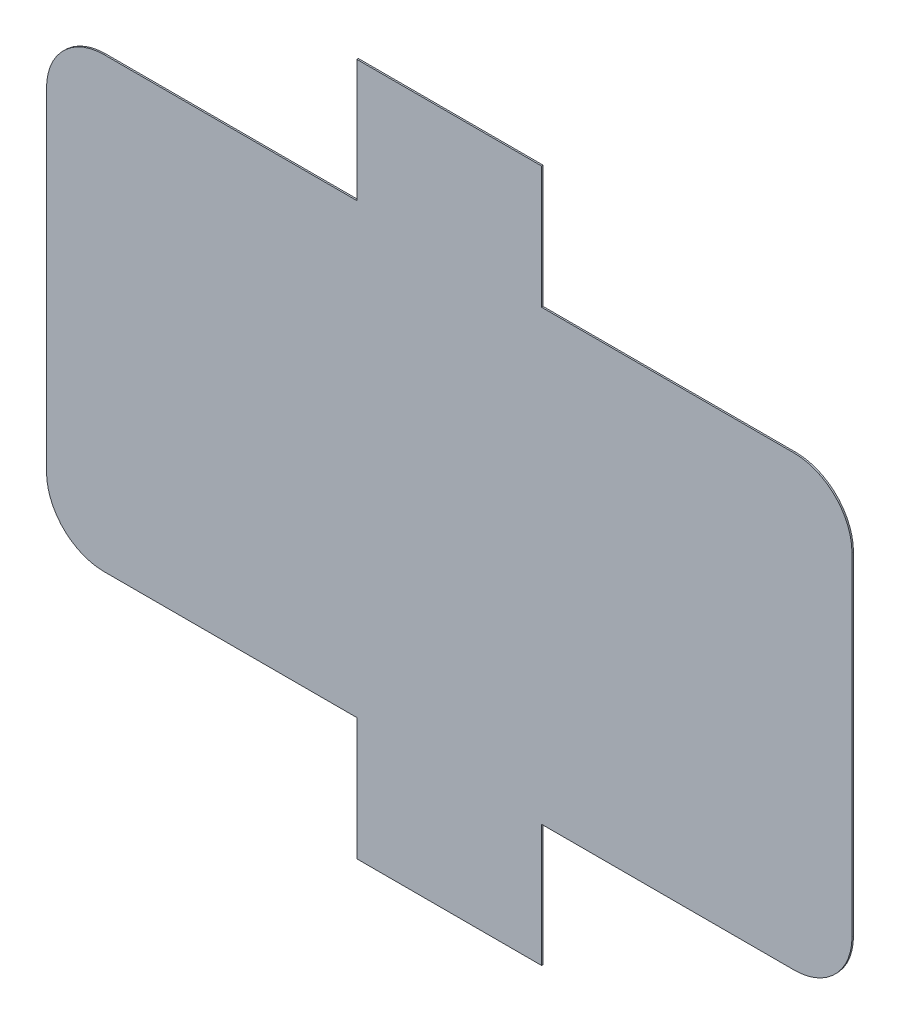
ISO-10303-21;
HEADER;
FILE_DESCRIPTION(('STEP AP214'),'2;1');
FILE_NAME('part.step','',(''),(''),'','','');
FILE_SCHEMA(('AUTOMOTIVE_DESIGN { 1 0 10303 214 1 1 1 1 }'));
ENDSEC;
DATA;
#1=APPLICATION_CONTEXT('core data for automotive mechanical design processes');
#2=APPLICATION_PROTOCOL_DEFINITION('international standard','automotive_design',2000,#1);
#3=PRODUCT_CONTEXT('',#1,'mechanical');
#4=PRODUCT('Part','Part','',(#3));
#5=PRODUCT_RELATED_PRODUCT_CATEGORY('part','',(#4));
#6=PRODUCT_DEFINITION_FORMATION('','',#4);
#7=PRODUCT_DEFINITION_CONTEXT('part definition',#1,'design');
#8=PRODUCT_DEFINITION('design','',#6,#7);
#9=PRODUCT_DEFINITION_SHAPE('','',#8);
#10=(LENGTH_UNIT() NAMED_UNIT(*) SI_UNIT(.MILLI.,.METRE.));
#11=(NAMED_UNIT(*) PLANE_ANGLE_UNIT() SI_UNIT($,.RADIAN.));
#12=(NAMED_UNIT(*) SI_UNIT($,.STERADIAN.) SOLID_ANGLE_UNIT());
#13=UNCERTAINTY_MEASURE_WITH_UNIT(LENGTH_MEASURE(1.E-05),#10,'distance_accuracy_value','');
#14=(GEOMETRIC_REPRESENTATION_CONTEXT(3) GLOBAL_UNCERTAINTY_ASSIGNED_CONTEXT((#13)) GLOBAL_UNIT_ASSIGNED_CONTEXT((#10,
#11,#12)) REPRESENTATION_CONTEXT('',''));
#15=CARTESIAN_POINT('',(0.,0.,0.));
#16=DIRECTION('',(0.,0.,1.));
#17=DIRECTION('',(1.,0.,0.));
#18=AXIS2_PLACEMENT_3D('',#15,#16,#17);
#19=CARTESIAN_POINT('',(-38.,30.,0.13));
#20=DIRECTION('',(0.,-1.,0.));
#21=DIRECTION('',(0.,0.,-1.));
#22=AXIS2_PLACEMENT_3D('',#19,#20,#21);
#23=PLANE('',#22);
#24=DIRECTION('',(-1.,0.,0.));
#25=VECTOR('',#24,1.);
#26=CARTESIAN_POINT('',(-38.,30.,0.13));
#27=LINE('',#26,#25);
#28=CARTESIAN_POINT('',(8.,30.,0.13));
#29=VERTEX_POINT('',#28);
#30=CARTESIAN_POINT('',(-8.,30.,0.13));
#31=VERTEX_POINT('',#30);
#32=EDGE_CURVE('E46',#29,#31,#27,.T.);
#33=ORIENTED_EDGE('',*,*,#32,.F.);
#34=DIRECTION('',(0.,0.,1.));
#35=VECTOR('',#34,1.);
#36=CARTESIAN_POINT('',(8.,30.,0.));
#37=LINE('',#36,#35);
#38=CARTESIAN_POINT('',(8.,30.,0.));
#39=VERTEX_POINT('',#38);
#40=EDGE_CURVE('E252',#39,#29,#37,.T.);
#41=ORIENTED_EDGE('',*,*,#40,.F.);
#42=DIRECTION('',(-1.,0.,0.));
#43=VECTOR('',#42,1.);
#44=CARTESIAN_POINT('',(-38.,30.,0.));
#45=LINE('',#44,#43);
#46=CARTESIAN_POINT('',(-8.,30.,0.));
#47=VERTEX_POINT('',#46);
#48=EDGE_CURVE('E272',#39,#47,#45,.T.);
#49=ORIENTED_EDGE('',*,*,#48,.T.);
#50=DIRECTION('',(0.,0.,1.));
#51=VECTOR('',#50,1.);
#52=CARTESIAN_POINT('',(-8.,30.,0.));
#53=LINE('',#52,#51);
#54=EDGE_CURVE('E53',#47,#31,#53,.T.);
#55=ORIENTED_EDGE('',*,*,#54,.T.);
#56=EDGE_LOOP('',(#33,#41,#49,#55));
#57=FACE_BOUND('',#56,.T.);
#58=ADVANCED_FACE('F37',(#57),#23,.F.);
#59=CARTESIAN_POINT('',(-38.,-30.,0.13));
#60=DIRECTION('',(0.,1.,0.));
#61=DIRECTION('',(0.,0.,1.));
#62=AXIS2_PLACEMENT_3D('',#59,#60,#61);
#63=PLANE('',#62);
#64=DIRECTION('',(1.,0.,0.));
#65=VECTOR('',#64,1.);
#66=CARTESIAN_POINT('',(-38.,-30.,0.13));
#67=LINE('',#66,#65);
#68=CARTESIAN_POINT('',(-8.,-30.,0.13));
#69=VERTEX_POINT('',#68);
#70=CARTESIAN_POINT('',(8.,-30.,0.13));
#71=VERTEX_POINT('',#70);
#72=EDGE_CURVE('E11',#69,#71,#67,.T.);
#73=ORIENTED_EDGE('',*,*,#72,.F.);
#74=DIRECTION('',(0.,0.,1.));
#75=VECTOR('',#74,1.);
#76=CARTESIAN_POINT('',(-8.,-30.,0.));
#77=LINE('',#76,#75);
#78=CARTESIAN_POINT('',(-8.,-30.,0.));
#79=VERTEX_POINT('',#78);
#80=EDGE_CURVE('E159',#79,#69,#77,.T.);
#81=ORIENTED_EDGE('',*,*,#80,.F.);
#82=DIRECTION('',(1.,0.,0.));
#83=VECTOR('',#82,1.);
#84=CARTESIAN_POINT('',(-38.,-30.,0.));
#85=LINE('',#84,#83);
#86=CARTESIAN_POINT('',(8.,-30.,0.));
#87=VERTEX_POINT('',#86);
#88=EDGE_CURVE('E40',#79,#87,#85,.T.);
#89=ORIENTED_EDGE('',*,*,#88,.T.);
#90=DIRECTION('',(0.,0.,1.));
#91=VECTOR('',#90,1.);
#92=CARTESIAN_POINT('',(8.,-30.,0.));
#93=LINE('',#92,#91);
#94=EDGE_CURVE('E260',#87,#71,#93,.T.);
#95=ORIENTED_EDGE('',*,*,#94,.T.);
#96=EDGE_LOOP('',(#73,#81,#89,#95));
#97=FACE_BOUND('',#96,.T.);
#98=ADVANCED_FACE('F280',(#97),#63,.F.);
#99=CARTESIAN_POINT('',(0.,0.,0.13));
#100=DIRECTION('',(0.,0.,1.));
#101=DIRECTION('',(1.,0.,0.));
#102=AXIS2_PLACEMENT_3D('',#99,#100,#101);
#103=PLANE('',#102);
#104=DIRECTION('',(0.,1.,0.));
#105=VECTOR('',#104,1.);
#106=CARTESIAN_POINT('',(-8.,30.,0.13));
#107=LINE('',#106,#105);
#108=CARTESIAN_POINT('',(-8.,19.4,0.13));
#109=VERTEX_POINT('',#108);
#110=EDGE_CURVE('E258',#109,#31,#107,.T.);
#111=ORIENTED_EDGE('',*,*,#110,.F.);
#112=DIRECTION('',(1.,0.,0.));
#113=VECTOR('',#112,1.);
#114=CARTESIAN_POINT('',(-8.,19.4,0.13));
#115=LINE('',#114,#113);
#116=CARTESIAN_POINT('',(-29.9,19.4,0.13));
#117=VERTEX_POINT('',#116);
#118=EDGE_CURVE('E174',#117,#109,#115,.T.);
#119=ORIENTED_EDGE('',*,*,#118,.F.);
#120=CARTESIAN_POINT('',(-29.9,14.4,0.13));
#121=DIRECTION('',(0.,0.,-1.));
#122=DIRECTION('',(1.,0.,0.));
#123=AXIS2_PLACEMENT_3D('',#120,#121,#122);
#124=CIRCLE('',#123,5.);
#125=CARTESIAN_POINT('',(-34.9,14.4,0.13));
#126=VERTEX_POINT('',#125);
#127=EDGE_CURVE('E179',#126,#117,#124,.T.);
#128=ORIENTED_EDGE('',*,*,#127,.F.);
#129=DIRECTION('',(0.,1.,0.));
#130=VECTOR('',#129,1.);
#131=CARTESIAN_POINT('',(-34.9,14.4,0.13));
#132=LINE('',#131,#130);
#133=CARTESIAN_POINT('',(-34.9,-14.4,0.13));
#134=VERTEX_POINT('',#133);
#135=EDGE_CURVE('E194',#134,#126,#132,.T.);
#136=ORIENTED_EDGE('',*,*,#135,.F.);
#137=CARTESIAN_POINT('',(-29.9,-14.4,0.13));
#138=DIRECTION('',(0.,0.,-1.));
#139=DIRECTION('',(1.,0.,0.));
#140=AXIS2_PLACEMENT_3D('',#137,#138,#139);
#141=CIRCLE('',#140,5.);
#142=CARTESIAN_POINT('',(-29.9,-19.4,0.13));
#143=VERTEX_POINT('',#142);
#144=EDGE_CURVE('E190',#143,#134,#141,.T.);
#145=ORIENTED_EDGE('',*,*,#144,.F.);
#146=DIRECTION('',(-1.,0.,0.));
#147=VECTOR('',#146,1.);
#148=CARTESIAN_POINT('',(-29.9,-19.4,0.13));
#149=LINE('',#148,#147);
#150=CARTESIAN_POINT('',(-8.,-19.4,0.13));
#151=VERTEX_POINT('',#150);
#152=EDGE_CURVE('E188',#151,#143,#149,.T.);
#153=ORIENTED_EDGE('',*,*,#152,.F.);
#154=DIRECTION('',(0.,1.,0.));
#155=VECTOR('',#154,1.);
#156=CARTESIAN_POINT('',(-8.,-30.,0.13));
#157=LINE('',#156,#155);
#158=EDGE_CURVE('E158',#69,#151,#157,.T.);
#159=ORIENTED_EDGE('',*,*,#158,.F.);
#160=ORIENTED_EDGE('',*,*,#72,.T.);
#161=DIRECTION('',(0.,-1.,0.));
#162=VECTOR('',#161,1.);
#163=CARTESIAN_POINT('',(8.,-30.,0.13));
#164=LINE('',#163,#162);
#165=CARTESIAN_POINT('',(8.,-19.4,0.13));
#166=VERTEX_POINT('',#165);
#167=EDGE_CURVE('E255',#166,#71,#164,.T.);
#168=ORIENTED_EDGE('',*,*,#167,.F.);
#169=DIRECTION('',(-1.,0.,0.));
#170=VECTOR('',#169,1.);
#171=CARTESIAN_POINT('',(29.9,-19.4,0.13));
#172=LINE('',#171,#170);
#173=CARTESIAN_POINT('',(29.9,-19.4,0.13));
#174=VERTEX_POINT('',#173);
#175=EDGE_CURVE('E227',#174,#166,#172,.T.);
#176=ORIENTED_EDGE('',*,*,#175,.F.);
#177=CARTESIAN_POINT('',(29.9,-14.4,0.13));
#178=DIRECTION('',(0.,0.,-1.));
#179=DIRECTION('',(-1.,0.,0.));
#180=AXIS2_PLACEMENT_3D('',#177,#178,#179);
#181=CIRCLE('',#180,5.);
#182=CARTESIAN_POINT('',(34.9,-14.3999999999999,0.13));
#183=VERTEX_POINT('',#182);
#184=EDGE_CURVE('E231',#183,#174,#181,.T.);
#185=ORIENTED_EDGE('',*,*,#184,.F.);
#186=DIRECTION('',(0.,-1.,0.));
#187=VECTOR('',#186,1.);
#188=CARTESIAN_POINT('',(34.9,14.4,0.13));
#189=LINE('',#188,#187);
#190=CARTESIAN_POINT('',(34.9,14.4,0.13));
#191=VERTEX_POINT('',#190);
#192=EDGE_CURVE('E234',#191,#183,#189,.T.);
#193=ORIENTED_EDGE('',*,*,#192,.F.);
#194=CARTESIAN_POINT('',(29.9,14.4,0.13));
#195=DIRECTION('',(0.,0.,-1.));
#196=DIRECTION('',(-1.,0.,0.));
#197=AXIS2_PLACEMENT_3D('',#194,#195,#196);
#198=CIRCLE('',#197,5.);
#199=CARTESIAN_POINT('',(29.9,19.4,0.13));
#200=VERTEX_POINT('',#199);
#201=EDGE_CURVE('E191',#200,#191,#198,.T.);
#202=ORIENTED_EDGE('',*,*,#201,.F.);
#203=DIRECTION('',(1.,0.,0.));
#204=VECTOR('',#203,1.);
#205=CARTESIAN_POINT('',(8.,19.4,0.13));
#206=LINE('',#205,#204);
#207=CARTESIAN_POINT('',(8.,19.4,0.13));
#208=VERTEX_POINT('',#207);
#209=EDGE_CURVE('E224',#208,#200,#206,.T.);
#210=ORIENTED_EDGE('',*,*,#209,.F.);
#211=DIRECTION('',(0.,-1.,0.));
#212=VECTOR('',#211,1.);
#213=CARTESIAN_POINT('',(8.,30.,0.13));
#214=LINE('',#213,#212);
#215=EDGE_CURVE('E256',#29,#208,#214,.T.);
#216=ORIENTED_EDGE('',*,*,#215,.F.);
#217=ORIENTED_EDGE('',*,*,#32,.T.);
#218=EDGE_LOOP('',(#111,#119,#128,#136,#145,#153,#159,#160,#168,#176,#185,#193,#202,#210,#216,#217));
#219=FACE_BOUND('',#218,.T.);
#220=ADVANCED_FACE('F282',(#219),#103,.T.);
#221=CARTESIAN_POINT('',(0.,0.,0.));
#222=DIRECTION('',(0.,0.,1.));
#223=DIRECTION('',(1.,0.,0.));
#224=AXIS2_PLACEMENT_3D('',#221,#222,#223);
#225=PLANE('',#224);
#226=DIRECTION('',(1.,0.,0.));
#227=VECTOR('',#226,1.);
#228=CARTESIAN_POINT('',(-8.,19.4,0.));
#229=LINE('',#228,#227);
#230=CARTESIAN_POINT('',(-29.9,19.4,0.));
#231=VERTEX_POINT('',#230);
#232=CARTESIAN_POINT('',(-8.,19.4,0.));
#233=VERTEX_POINT('',#232);
#234=EDGE_CURVE('E169',#231,#233,#229,.T.);
#235=ORIENTED_EDGE('',*,*,#234,.T.);
#236=DIRECTION('',(0.,1.,0.));
#237=VECTOR('',#236,1.);
#238=CARTESIAN_POINT('',(-8.,30.,0.));
#239=LINE('',#238,#237);
#240=EDGE_CURVE('E268',#233,#47,#239,.T.);
#241=ORIENTED_EDGE('',*,*,#240,.T.);
#242=ORIENTED_EDGE('',*,*,#48,.F.);
#243=DIRECTION('',(0.,-1.,0.));
#244=VECTOR('',#243,1.);
#245=CARTESIAN_POINT('',(8.,30.,0.));
#246=LINE('',#245,#244);
#247=CARTESIAN_POINT('',(8.,19.4,0.));
#248=VERTEX_POINT('',#247);
#249=EDGE_CURVE('E254',#39,#248,#246,.T.);
#250=ORIENTED_EDGE('',*,*,#249,.T.);
#251=DIRECTION('',(1.,0.,0.));
#252=VECTOR('',#251,1.);
#253=CARTESIAN_POINT('',(8.,19.4,0.));
#254=LINE('',#253,#252);
#255=CARTESIAN_POINT('',(29.9,19.4,0.));
#256=VERTEX_POINT('',#255);
#257=EDGE_CURVE('E211',#248,#256,#254,.T.);
#258=ORIENTED_EDGE('',*,*,#257,.T.);
#259=CARTESIAN_POINT('',(29.9,14.4,0.));
#260=DIRECTION('',(0.,0.,-1.));
#261=DIRECTION('',(-1.,0.,0.));
#262=AXIS2_PLACEMENT_3D('',#259,#260,#261);
#263=CIRCLE('',#262,5.);
#264=CARTESIAN_POINT('',(34.9,14.4,0.));
#265=VERTEX_POINT('',#264);
#266=EDGE_CURVE('E228',#256,#265,#263,.T.);
#267=ORIENTED_EDGE('',*,*,#266,.T.);
#268=DIRECTION('',(0.,-1.,0.));
#269=VECTOR('',#268,1.);
#270=CARTESIAN_POINT('',(34.9,14.4,0.));
#271=LINE('',#270,#269);
#272=CARTESIAN_POINT('',(34.9,-14.3999999999999,0.));
#273=VERTEX_POINT('',#272);
#274=EDGE_CURVE('E247',#265,#273,#271,.T.);
#275=ORIENTED_EDGE('',*,*,#274,.T.);
#276=CARTESIAN_POINT('',(29.9,-14.4,0.));
#277=DIRECTION('',(0.,0.,-1.));
#278=DIRECTION('',(-1.,0.,0.));
#279=AXIS2_PLACEMENT_3D('',#276,#277,#278);
#280=CIRCLE('',#279,5.);
#281=CARTESIAN_POINT('',(29.9,-19.4,0.));
#282=VERTEX_POINT('',#281);
#283=EDGE_CURVE('E244',#273,#282,#280,.T.);
#284=ORIENTED_EDGE('',*,*,#283,.T.);
#285=DIRECTION('',(-1.,0.,0.));
#286=VECTOR('',#285,1.);
#287=CARTESIAN_POINT('',(29.9,-19.4,0.));
#288=LINE('',#287,#286);
#289=CARTESIAN_POINT('',(8.,-19.4,0.));
#290=VERTEX_POINT('',#289);
#291=EDGE_CURVE('E241',#282,#290,#288,.T.);
#292=ORIENTED_EDGE('',*,*,#291,.T.);
#293=DIRECTION('',(0.,-1.,0.));
#294=VECTOR('',#293,1.);
#295=CARTESIAN_POINT('',(8.,-30.,0.));
#296=LINE('',#295,#294);
#297=EDGE_CURVE('E263',#290,#87,#296,.T.);
#298=ORIENTED_EDGE('',*,*,#297,.T.);
#299=ORIENTED_EDGE('',*,*,#88,.F.);
#300=DIRECTION('',(0.,1.,0.));
#301=VECTOR('',#300,1.);
#302=CARTESIAN_POINT('',(-8.,-30.,0.));
#303=LINE('',#302,#301);
#304=CARTESIAN_POINT('',(-8.,-19.4,0.));
#305=VERTEX_POINT('',#304);
#306=EDGE_CURVE('E147',#79,#305,#303,.T.);
#307=ORIENTED_EDGE('',*,*,#306,.T.);
#308=DIRECTION('',(-1.,0.,0.));
#309=VECTOR('',#308,1.);
#310=CARTESIAN_POINT('',(-29.9,-19.4,0.));
#311=LINE('',#310,#309);
#312=CARTESIAN_POINT('',(-29.9,-19.4,0.));
#313=VERTEX_POINT('',#312);
#314=EDGE_CURVE('E153',#305,#313,#311,.T.);
#315=ORIENTED_EDGE('',*,*,#314,.T.);
#316=CARTESIAN_POINT('',(-29.9,-14.4,0.));
#317=DIRECTION('',(0.,0.,-1.));
#318=DIRECTION('',(1.,0.,0.));
#319=AXIS2_PLACEMENT_3D('',#316,#317,#318);
#320=CIRCLE('',#319,5.);
#321=CARTESIAN_POINT('',(-34.9,-14.4,0.));
#322=VERTEX_POINT('',#321);
#323=EDGE_CURVE('E173',#313,#322,#320,.T.);
#324=ORIENTED_EDGE('',*,*,#323,.T.);
#325=DIRECTION('',(0.,1.,0.));
#326=VECTOR('',#325,1.);
#327=CARTESIAN_POINT('',(-34.9,14.4,0.));
#328=LINE('',#327,#326);
#329=CARTESIAN_POINT('',(-34.9,14.4,0.));
#330=VERTEX_POINT('',#329);
#331=EDGE_CURVE('E176',#322,#330,#328,.T.);
#332=ORIENTED_EDGE('',*,*,#331,.T.);
#333=CARTESIAN_POINT('',(-29.9,14.4,0.));
#334=DIRECTION('',(0.,0.,-1.));
#335=DIRECTION('',(1.,0.,0.));
#336=AXIS2_PLACEMENT_3D('',#333,#334,#335);
#337=CIRCLE('',#336,5.);
#338=EDGE_CURVE('E184',#330,#231,#337,.T.);
#339=ORIENTED_EDGE('',*,*,#338,.T.);
#340=EDGE_LOOP('',(#235,#241,#242,#250,#258,#267,#275,#284,#292,#298,#299,#307,#315,#324,#332,#339));
#341=FACE_BOUND('',#340,.T.);
#342=ADVANCED_FACE('F150',(#341),#225,.F.);
#343=CARTESIAN_POINT('',(-8.,30.,0.));
#344=DIRECTION('',(1.,0.,0.));
#345=DIRECTION('',(0.,1.,0.));
#346=AXIS2_PLACEMENT_3D('',#343,#344,#345);
#347=PLANE('',#346);
#348=ORIENTED_EDGE('',*,*,#110,.T.);
#349=ORIENTED_EDGE('',*,*,#54,.F.);
#350=ORIENTED_EDGE('',*,*,#240,.F.);
#351=DIRECTION('',(0.,0.,1.));
#352=VECTOR('',#351,1.);
#353=CARTESIAN_POINT('',(-8.,19.4,0.));
#354=LINE('',#353,#352);
#355=EDGE_CURVE('E199',#233,#109,#354,.T.);
#356=ORIENTED_EDGE('',*,*,#355,.T.);
#357=EDGE_LOOP('',(#348,#349,#350,#356));
#358=FACE_BOUND('',#357,.T.);
#359=ADVANCED_FACE('F299',(#358),#347,.F.);
#360=CARTESIAN_POINT('',(8.,30.,0.));
#361=DIRECTION('',(-1.,0.,0.));
#362=DIRECTION('',(0.,0.,1.));
#363=AXIS2_PLACEMENT_3D('',#360,#361,#362);
#364=PLANE('',#363);
#365=ORIENTED_EDGE('',*,*,#215,.T.);
#366=DIRECTION('',(0.,0.,1.));
#367=VECTOR('',#366,1.);
#368=CARTESIAN_POINT('',(8.,19.4,0.));
#369=LINE('',#368,#367);
#370=EDGE_CURVE('E219',#248,#208,#369,.T.);
#371=ORIENTED_EDGE('',*,*,#370,.F.);
#372=ORIENTED_EDGE('',*,*,#249,.F.);
#373=ORIENTED_EDGE('',*,*,#40,.T.);
#374=EDGE_LOOP('',(#365,#371,#372,#373));
#375=FACE_BOUND('',#374,.T.);
#376=ADVANCED_FACE('F304',(#375),#364,.F.);
#377=CARTESIAN_POINT('',(8.,-30.,0.));
#378=DIRECTION('',(-1.,0.,0.));
#379=DIRECTION('',(0.,0.,1.));
#380=AXIS2_PLACEMENT_3D('',#377,#378,#379);
#381=PLANE('',#380);
#382=ORIENTED_EDGE('',*,*,#167,.T.);
#383=ORIENTED_EDGE('',*,*,#94,.F.);
#384=ORIENTED_EDGE('',*,*,#297,.F.);
#385=DIRECTION('',(0.,0.,1.));
#386=VECTOR('',#385,1.);
#387=CARTESIAN_POINT('',(8.,-19.4,0.));
#388=LINE('',#387,#386);
#389=EDGE_CURVE('E216',#290,#166,#388,.T.);
#390=ORIENTED_EDGE('',*,*,#389,.T.);
#391=EDGE_LOOP('',(#382,#383,#384,#390));
#392=FACE_BOUND('',#391,.T.);
#393=ADVANCED_FACE('F327',(#392),#381,.F.);
#394=CARTESIAN_POINT('',(-8.,-30.,0.));
#395=DIRECTION('',(1.,0.,0.));
#396=DIRECTION('',(0.,1.,0.));
#397=AXIS2_PLACEMENT_3D('',#394,#395,#396);
#398=PLANE('',#397);
#399=ORIENTED_EDGE('',*,*,#158,.T.);
#400=DIRECTION('',(0.,0.,1.));
#401=VECTOR('',#400,1.);
#402=CARTESIAN_POINT('',(-8.,-19.4,0.));
#403=LINE('',#402,#401);
#404=EDGE_CURVE('E162',#305,#151,#403,.T.);
#405=ORIENTED_EDGE('',*,*,#404,.F.);
#406=ORIENTED_EDGE('',*,*,#306,.F.);
#407=ORIENTED_EDGE('',*,*,#80,.T.);
#408=EDGE_LOOP('',(#399,#405,#406,#407));
#409=FACE_BOUND('',#408,.T.);
#410=ADVANCED_FACE('F163',(#409),#398,.F.);
#411=CARTESIAN_POINT('',(-8.,19.4,0.));
#412=DIRECTION('',(0.,-1.,0.));
#413=DIRECTION('',(1.,0.,0.));
#414=AXIS2_PLACEMENT_3D('',#411,#412,#413);
#415=PLANE('',#414);
#416=ORIENTED_EDGE('',*,*,#118,.T.);
#417=ORIENTED_EDGE('',*,*,#355,.F.);
#418=ORIENTED_EDGE('',*,*,#234,.F.);
#419=DIRECTION('',(0.,0.,1.));
#420=VECTOR('',#419,1.);
#421=CARTESIAN_POINT('',(-29.9,19.4,0.));
#422=LINE('',#421,#420);
#423=EDGE_CURVE('E202',#231,#117,#422,.T.);
#424=ORIENTED_EDGE('',*,*,#423,.T.);
#425=EDGE_LOOP('',(#416,#417,#418,#424));
#426=FACE_BOUND('',#425,.T.);
#427=ADVANCED_FACE('F298',(#426),#415,.F.);
#428=CARTESIAN_POINT('',(-29.9,14.4,0.));
#429=DIRECTION('',(0.,0.,1.));
#430=DIRECTION('',(1.,0.,0.));
#431=AXIS2_PLACEMENT_3D('',#428,#429,#430);
#432=CYLINDRICAL_SURFACE('',#431,5.);
#433=ORIENTED_EDGE('',*,*,#127,.T.);
#434=ORIENTED_EDGE('',*,*,#423,.F.);
#435=ORIENTED_EDGE('',*,*,#338,.F.);
#436=DIRECTION('',(0.,0.,1.));
#437=VECTOR('',#436,1.);
#438=CARTESIAN_POINT('',(-34.9,14.4,0.));
#439=LINE('',#438,#437);
#440=EDGE_CURVE('E204',#330,#126,#439,.T.);
#441=ORIENTED_EDGE('',*,*,#440,.T.);
#442=EDGE_LOOP('',(#433,#434,#435,#441));
#443=FACE_BOUND('',#442,.T.);
#444=ADVANCED_FACE('F293',(#443),#432,.T.);
#445=CARTESIAN_POINT('',(-34.9,14.4,0.));
#446=DIRECTION('',(1.,0.,0.));
#447=DIRECTION('',(0.,1.,0.));
#448=AXIS2_PLACEMENT_3D('',#445,#446,#447);
#449=PLANE('',#448);
#450=ORIENTED_EDGE('',*,*,#135,.T.);
#451=ORIENTED_EDGE('',*,*,#440,.F.);
#452=ORIENTED_EDGE('',*,*,#331,.F.);
#453=DIRECTION('',(0.,0.,1.));
#454=VECTOR('',#453,1.);
#455=CARTESIAN_POINT('',(-34.9,-14.4,0.));
#456=LINE('',#455,#454);
#457=EDGE_CURVE('E206',#322,#134,#456,.T.);
#458=ORIENTED_EDGE('',*,*,#457,.T.);
#459=EDGE_LOOP('',(#450,#451,#452,#458));
#460=FACE_BOUND('',#459,.T.);
#461=ADVANCED_FACE('F291',(#460),#449,.F.);
#462=CARTESIAN_POINT('',(-29.9,-14.4,0.));
#463=DIRECTION('',(0.,0.,1.));
#464=DIRECTION('',(1.,0.,0.));
#465=AXIS2_PLACEMENT_3D('',#462,#463,#464);
#466=CYLINDRICAL_SURFACE('',#465,5.);
#467=ORIENTED_EDGE('',*,*,#144,.T.);
#468=ORIENTED_EDGE('',*,*,#457,.F.);
#469=ORIENTED_EDGE('',*,*,#323,.F.);
#470=DIRECTION('',(0.,0.,1.));
#471=VECTOR('',#470,1.);
#472=CARTESIAN_POINT('',(-29.9,-19.4,0.));
#473=LINE('',#472,#471);
#474=EDGE_CURVE('E168',#313,#143,#473,.T.);
#475=ORIENTED_EDGE('',*,*,#474,.T.);
#476=EDGE_LOOP('',(#467,#468,#469,#475));
#477=FACE_BOUND('',#476,.T.);
#478=ADVANCED_FACE('F287',(#477),#466,.T.);
#479=CARTESIAN_POINT('',(-29.9,-19.4,0.));
#480=DIRECTION('',(0.,1.,0.));
#481=DIRECTION('',(-1.,0.,0.));
#482=AXIS2_PLACEMENT_3D('',#479,#480,#481);
#483=PLANE('',#482);
#484=ORIENTED_EDGE('',*,*,#152,.T.);
#485=ORIENTED_EDGE('',*,*,#474,.F.);
#486=ORIENTED_EDGE('',*,*,#314,.F.);
#487=ORIENTED_EDGE('',*,*,#404,.T.);
#488=EDGE_LOOP('',(#484,#485,#486,#487));
#489=FACE_BOUND('',#488,.T.);
#490=ADVANCED_FACE('F171',(#489),#483,.F.);
#491=CARTESIAN_POINT('',(29.9,14.4,0.));
#492=DIRECTION('',(0.,0.,1.));
#493=DIRECTION('',(1.,0.,0.));
#494=AXIS2_PLACEMENT_3D('',#491,#492,#493);
#495=CYLINDRICAL_SURFACE('',#494,5.);
#496=ORIENTED_EDGE('',*,*,#201,.T.);
#497=DIRECTION('',(0.,0.,1.));
#498=VECTOR('',#497,1.);
#499=CARTESIAN_POINT('',(34.9,14.4,0.));
#500=LINE('',#499,#498);
#501=EDGE_CURVE('E209',#265,#191,#500,.T.);
#502=ORIENTED_EDGE('',*,*,#501,.F.);
#503=ORIENTED_EDGE('',*,*,#266,.F.);
#504=DIRECTION('',(0.,0.,1.));
#505=VECTOR('',#504,1.);
#506=CARTESIAN_POINT('',(29.9,19.4,0.));
#507=LINE('',#506,#505);
#508=EDGE_CURVE('E222',#256,#200,#507,.T.);
#509=ORIENTED_EDGE('',*,*,#508,.T.);
#510=EDGE_LOOP('',(#496,#502,#503,#509));
#511=FACE_BOUND('',#510,.T.);
#512=ADVANCED_FACE('F312',(#511),#495,.T.);
#513=CARTESIAN_POINT('',(8.,19.4,0.));
#514=DIRECTION('',(0.,-1.,0.));
#515=DIRECTION('',(1.,0.,0.));
#516=AXIS2_PLACEMENT_3D('',#513,#514,#515);
#517=PLANE('',#516);
#518=ORIENTED_EDGE('',*,*,#209,.T.);
#519=ORIENTED_EDGE('',*,*,#508,.F.);
#520=ORIENTED_EDGE('',*,*,#257,.F.);
#521=ORIENTED_EDGE('',*,*,#370,.T.);
#522=EDGE_LOOP('',(#518,#519,#520,#521));
#523=FACE_BOUND('',#522,.T.);
#524=ADVANCED_FACE('F309',(#523),#517,.F.);
#525=CARTESIAN_POINT('',(29.9,-19.4,0.));
#526=DIRECTION('',(0.,1.,0.));
#527=DIRECTION('',(-1.,0.,0.));
#528=AXIS2_PLACEMENT_3D('',#525,#526,#527);
#529=PLANE('',#528);
#530=ORIENTED_EDGE('',*,*,#175,.T.);
#531=ORIENTED_EDGE('',*,*,#389,.F.);
#532=ORIENTED_EDGE('',*,*,#291,.F.);
#533=DIRECTION('',(0.,0.,1.));
#534=VECTOR('',#533,1.);
#535=CARTESIAN_POINT('',(29.9,-19.4,0.));
#536=LINE('',#535,#534);
#537=EDGE_CURVE('E214',#282,#174,#536,.T.);
#538=ORIENTED_EDGE('',*,*,#537,.T.);
#539=EDGE_LOOP('',(#530,#531,#532,#538));
#540=FACE_BOUND('',#539,.T.);
#541=ADVANCED_FACE('F325',(#540),#529,.F.);
#542=CARTESIAN_POINT('',(29.9,-14.4,0.));
#543=DIRECTION('',(0.,0.,1.));
#544=DIRECTION('',(1.,0.,0.));
#545=AXIS2_PLACEMENT_3D('',#542,#543,#544);
#546=CYLINDRICAL_SURFACE('',#545,5.);
#547=ORIENTED_EDGE('',*,*,#184,.T.);
#548=ORIENTED_EDGE('',*,*,#537,.F.);
#549=ORIENTED_EDGE('',*,*,#283,.F.);
#550=DIRECTION('',(0.,0.,1.));
#551=VECTOR('',#550,1.);
#552=CARTESIAN_POINT('',(34.9,-14.3999999999999,0.));
#553=LINE('',#552,#551);
#554=EDGE_CURVE('E212',#273,#183,#553,.T.);
#555=ORIENTED_EDGE('',*,*,#554,.T.);
#556=EDGE_LOOP('',(#547,#548,#549,#555));
#557=FACE_BOUND('',#556,.T.);
#558=ADVANCED_FACE('F320',(#557),#546,.T.);
#559=CARTESIAN_POINT('',(34.9,14.4,0.));
#560=DIRECTION('',(-1.,0.,0.));
#561=DIRECTION('',(0.,-1.,0.));
#562=AXIS2_PLACEMENT_3D('',#559,#560,#561);
#563=PLANE('',#562);
#564=ORIENTED_EDGE('',*,*,#192,.T.);
#565=ORIENTED_EDGE('',*,*,#554,.F.);
#566=ORIENTED_EDGE('',*,*,#274,.F.);
#567=ORIENTED_EDGE('',*,*,#501,.T.);
#568=EDGE_LOOP('',(#564,#565,#566,#567));
#569=FACE_BOUND('',#568,.T.);
#570=ADVANCED_FACE('F316',(#569),#563,.F.);
#571=CLOSED_SHELL('',(#58,#98,#220,#342,#359,#376,#393,#410,#427,#444,#461,#478,#490,#512,#524,
#541,#558,#570));
#572=MANIFOLD_SOLID_BREP('B2',#571);
#573=ADVANCED_BREP_SHAPE_REPRESENTATION('',(#18,#572),#14);
#574=SHAPE_DEFINITION_REPRESENTATION(#9,#573);
ENDSEC;
END-ISO-10303-21;
